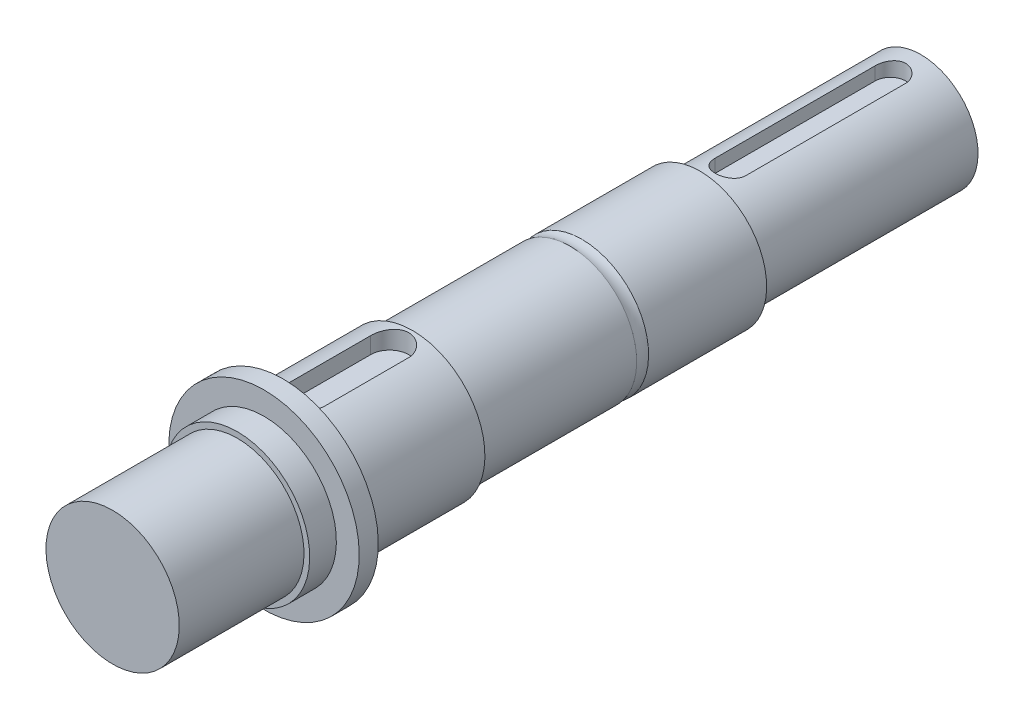
ISO-10303-21;
HEADER;
FILE_DESCRIPTION(('STEP AP214'),'2;1');
FILE_NAME('part.step','',(''),(''),'','','');
FILE_SCHEMA(('AUTOMOTIVE_DESIGN { 1 0 10303 214 1 1 1 1 }'));
ENDSEC;
DATA;
#1=APPLICATION_CONTEXT('core data for automotive mechanical design processes');
#2=APPLICATION_PROTOCOL_DEFINITION('international standard','automotive_design',2000,#1);
#3=PRODUCT_CONTEXT('',#1,'mechanical');
#4=PRODUCT('Part','Part','',(#3));
#5=PRODUCT_RELATED_PRODUCT_CATEGORY('part','',(#4));
#6=PRODUCT_DEFINITION_FORMATION('','',#4);
#7=PRODUCT_DEFINITION_CONTEXT('part definition',#1,'design');
#8=PRODUCT_DEFINITION('design','',#6,#7);
#9=PRODUCT_DEFINITION_SHAPE('','',#8);
#10=(LENGTH_UNIT() NAMED_UNIT(*) SI_UNIT(.MILLI.,.METRE.));
#11=(NAMED_UNIT(*) PLANE_ANGLE_UNIT() SI_UNIT($,.RADIAN.));
#12=(NAMED_UNIT(*) SI_UNIT($,.STERADIAN.) SOLID_ANGLE_UNIT());
#13=UNCERTAINTY_MEASURE_WITH_UNIT(LENGTH_MEASURE(1.E-05),#10,'distance_accuracy_value','');
#14=(GEOMETRIC_REPRESENTATION_CONTEXT(3) GLOBAL_UNCERTAINTY_ASSIGNED_CONTEXT((#13)) GLOBAL_UNIT_ASSIGNED_CONTEXT((#10,
#11,#12)) REPRESENTATION_CONTEXT('',''));
#15=CARTESIAN_POINT('',(0.,0.,0.));
#16=DIRECTION('',(0.,0.,1.));
#17=DIRECTION('',(1.,0.,0.));
#18=AXIS2_PLACEMENT_3D('',#15,#16,#17);
#19=CARTESIAN_POINT('',(0.,0.,0.));
#20=DIRECTION('',(0.,0.,-1.));
#21=DIRECTION('',(0.,1.,0.));
#22=AXIS2_PLACEMENT_3D('',#19,#20,#21);
#23=CYLINDRICAL_SURFACE('',#22,15.);
#24=CARTESIAN_POINT('',(0.,0.,58.));
#25=DIRECTION('',(0.,0.,-1.));
#26=DIRECTION('',(0.,1.,0.));
#27=AXIS2_PLACEMENT_3D('',#24,#25,#26);
#28=CIRCLE('',#27,15.);
#29=CARTESIAN_POINT('',(0.,15.,58.));
#30=VERTEX_POINT('',#29);
#31=EDGE_CURVE('E47',#30,#30,#28,.T.);
#32=ORIENTED_EDGE('',*,*,#31,.T.);
#33=EDGE_LOOP('',(#32));
#34=FACE_BOUND('',#33,.T.);
#35=CARTESIAN_POINT('',(0.,0.,0.));
#36=DIRECTION('',(0.,0.,-1.));
#37=DIRECTION('',(0.,1.,0.));
#38=AXIS2_PLACEMENT_3D('',#35,#36,#37);
#39=CIRCLE('',#38,15.);
#40=CARTESIAN_POINT('',(0.,15.,0.));
#41=VERTEX_POINT('',#40);
#42=EDGE_CURVE('E11',#41,#41,#39,.T.);
#43=ORIENTED_EDGE('',*,*,#42,.F.);
#44=EDGE_LOOP('',(#43));
#45=FACE_BOUND('',#44,.T.);
#46=DIRECTION('',(0.,0.,-1.));
#47=VECTOR('',#46,1.);
#48=CARTESIAN_POINT('',(4.,14.456832294801,0.));
#49=LINE('',#48,#47);
#50=CARTESIAN_POINT('',(4.,14.456832294801,50.));
#51=VERTEX_POINT('',#50);
#52=CARTESIAN_POINT('',(4.,14.456832294801,7.99999999999999));
#53=VERTEX_POINT('',#52);
#54=EDGE_CURVE('E125',#51,#53,#49,.T.);
#55=ORIENTED_EDGE('',*,*,#54,.F.);
#56=CARTESIAN_POINT('',(-4.,14.456832294801,50.));
#57=CARTESIAN_POINT('',(-4.00001309389174,14.4568189842467,50.1103582434041));
#58=CARTESIAN_POINT('',(-3.99543311151603,14.4580956467717,50.2207085219929));
#59=CARTESIAN_POINT('',(-3.97718874589725,14.4631301353516,50.4405786539661));
#60=CARTESIAN_POINT('',(-3.96352604983924,14.4668875005959,50.5500986577597));
#61=CARTESIAN_POINT('',(-3.92725695741263,14.4767740441058,50.767301653514));
#62=CARTESIAN_POINT('',(-3.90466984692446,14.482898107258,50.8749880878483));
#63=CARTESIAN_POINT('',(-3.85076543838184,14.4973231400467,51.0879748603556));
#64=CARTESIAN_POINT('',(-3.81944798699437,14.5056241479174,51.1932751565853));
#65=CARTESIAN_POINT('',(-3.71275643853686,14.5334412456827,51.5044634187753));
#66=CARTESIAN_POINT('',(-3.62460332607936,14.5558829598251,51.7058749335474));
#67=CARTESIAN_POINT('',(-3.4169578047582,14.6060171290377,52.0910207596257));
#68=CARTESIAN_POINT('',(-3.29745504324307,14.6337113178034,52.2747492039724));
#69=CARTESIAN_POINT('',(-3.0273032087801,14.6920016406366,52.6239705769278));
#70=CARTESIAN_POINT('',(-2.87601544465619,14.7226489452442,52.7889618409657));
#71=CARTESIAN_POINT('',(-2.54795832924029,14.7829523618628,53.0915575669616));
#72=CARTESIAN_POINT('',(-2.37118484921249,14.8126083123117,53.2291575828684));
#73=CARTESIAN_POINT('',(-1.99367199592156,14.8681604116921,53.4751721301854));
#74=CARTESIAN_POINT('',(-1.79259414843396,14.8939887414057,53.5830839655783));
#75=CARTESIAN_POINT('',(-1.37435575552791,14.9383834129136,53.7633728889612));
#76=CARTESIAN_POINT('',(-1.15719869214847,14.9569513215518,53.8357576447769));
#77=CARTESIAN_POINT('',(-0.718234307369676,14.9843709217852,53.9413098251693));
#78=CARTESIAN_POINT('',(-0.49664729342811,14.9934353394137,53.9753372128936));
#79=CARTESIAN_POINT('',(-0.0507319917605803,15.0015705103632,54.005914313223));
#80=CARTESIAN_POINT('',(0.173595891963453,15.0006427191926,54.0024694841925));
#81=CARTESIAN_POINT('',(0.61262950264217,14.9890534931376,53.9588043136319));
#82=CARTESIAN_POINT('',(0.827435206418324,14.9786381919443,53.9195138723437));
#83=CARTESIAN_POINT('',(1.24728467665105,14.9495347795912,53.8067748491367));
#84=CARTESIAN_POINT('',(1.45232797980575,14.9308462762363,53.7333246478493));
#85=CARTESIAN_POINT('',(1.84920963545355,14.8869312076945,53.5536400337472));
#86=CARTESIAN_POINT('',(2.04089626466617,14.8616414267933,53.4470866277702));
#87=CARTESIAN_POINT('',(2.40398441957148,14.8072486052897,53.2044572310354));
#88=CARTESIAN_POINT('',(2.57538239000351,14.7781448982353,53.0683760778169));
#89=CARTESIAN_POINT('',(2.8985493503678,14.7182294237973,52.7656720288986));
#90=CARTESIAN_POINT('',(3.04955722400808,14.6873926412643,52.5982419921057));
#91=CARTESIAN_POINT('',(3.32161448391783,14.6282716207252,52.2399571592908));
#92=CARTESIAN_POINT('',(3.4426555807802,14.5999880903709,52.0490959035188));
#93=CARTESIAN_POINT('',(3.59932937334133,14.5618587427771,51.7486467166354));
#94=CARTESIAN_POINT('',(3.64754371945348,14.5498268172621,51.645711084959));
#95=CARTESIAN_POINT('',(3.73509417643326,14.5275984074125,51.4359536787285));
#96=CARTESIAN_POINT('',(3.77443385857863,14.5174011851057,51.3291334875373));
#97=CARTESIAN_POINT('',(3.843867838105,14.4991713081511,51.1124805807798));
#98=CARTESIAN_POINT('',(3.87397173088603,14.4911364080612,51.002651121807));
#99=CARTESIAN_POINT('',(3.92471856960774,14.4774747012191,50.780724778875));
#100=CARTESIAN_POINT('',(3.9453659249532,14.4718467722231,50.66862897718));
#101=CARTESIAN_POINT('',(3.97411378733403,14.4639761334309,50.463748975282));
#102=CARTESIAN_POINT('',(3.98382319960777,14.4613012625133,50.3712035538327));
#103=CARTESIAN_POINT('',(3.99676420153356,14.4577275048596,50.1857746466901));
#104=CARTESIAN_POINT('',(4.00000603663184,14.4568258092259,50.0928919295675));
#105=CARTESIAN_POINT('',(4.,14.456832294801,50.));
#106=B_SPLINE_CURVE_WITH_KNOTS('',3,(#56,#57,#58,#59,#60,#61,#62,#63,#64,#65,#66,#67,#68,#69,
#70,#71,#72,#73,#74,#75,#76,#77,#78,#79,#80,#81,#82,#83,#84,#85,#86,#87,#88,#89,#90,#91,#92,#93,
#94,#95,#96,#97,#98,#99,#100,#101,#102,#103,#104,#105),.UNSPECIFIED.,.F.,.F.,(4,2,2,2,2,2,2,2,2,
2,2,2,2,2,2,2,2,2,2,2,2,2,2,2,4),(0.,0.330958670878051,0.66185588076851,0.992041890688581,
1.32223370010825,1.9819070018718,2.64179842357631,3.3164963753615,3.99130375261118,
4.67691814590523,5.3623844975935,6.03215661862343,6.7018311790669,7.35461236515045,
8.00742449996358,8.66673340793703,9.32615767867957,10.0057598785669,10.6855498604333,
11.0281077435251,11.3705275300852,11.7125903499582,12.0544935096114,12.3335333037377,
12.6121307120356),.UNSPECIFIED.);
#107=CARTESIAN_POINT('',(-4.,14.456832294801,50.));
#108=VERTEX_POINT('',#107);
#109=EDGE_CURVE('E108',#108,#51,#106,.T.);
#110=ORIENTED_EDGE('',*,*,#109,.F.);
#111=DIRECTION('',(0.,0.,-1.));
#112=VECTOR('',#111,1.);
#113=CARTESIAN_POINT('',(-4.,14.456832294801,0.));
#114=LINE('',#113,#112);
#115=CARTESIAN_POINT('',(-4.,14.456832294801,7.99999999999999));
#116=VERTEX_POINT('',#115);
#117=EDGE_CURVE('E119',#116,#108,#114,.F.);
#118=ORIENTED_EDGE('',*,*,#117,.F.);
#119=CARTESIAN_POINT('',(4.,14.456832294801,7.99999999999999));
#120=CARTESIAN_POINT('',(4.00001309389174,14.4568189842467,7.88964175659588));
#121=CARTESIAN_POINT('',(3.99543311151603,14.4580956467717,7.7792914780071));
#122=CARTESIAN_POINT('',(3.97718874589725,14.4631301353517,7.55942134603392));
#123=CARTESIAN_POINT('',(3.96352604983924,14.4668875005959,7.44990134224024));
#124=CARTESIAN_POINT('',(3.92725695741262,14.4767740441058,7.23269834648596));
#125=CARTESIAN_POINT('',(3.90466984692446,14.482898107258,7.12501191215171));
#126=CARTESIAN_POINT('',(3.85076543838184,14.4973231400467,6.91202513964435));
#127=CARTESIAN_POINT('',(3.81944798699437,14.5056241479174,6.80672484341467));
#128=CARTESIAN_POINT('',(3.71275643853686,14.5334412456827,6.49553658122465));
#129=CARTESIAN_POINT('',(3.62460332607936,14.5558829598252,6.29412506645257));
#130=CARTESIAN_POINT('',(3.4169578047582,14.6060171290377,5.90897924037424));
#131=CARTESIAN_POINT('',(3.29745504324306,14.6337113178035,5.72525079602755));
#132=CARTESIAN_POINT('',(3.0273032087801,14.6920016406366,5.37602942307217));
#133=CARTESIAN_POINT('',(2.87601544465619,14.7226489452442,5.21103815903426));
#134=CARTESIAN_POINT('',(2.54795832924029,14.7829523618628,4.90844243303835));
#135=CARTESIAN_POINT('',(2.37118484921249,14.8126083123117,4.77084241713158));
#136=CARTESIAN_POINT('',(1.99367199592156,14.8681604116921,4.52482786981454));
#137=CARTESIAN_POINT('',(1.79259414843396,14.8939887414057,4.41691603442168));
#138=CARTESIAN_POINT('',(1.3743557555279,14.9383834129136,4.23662711103874));
#139=CARTESIAN_POINT('',(1.15719869214847,14.9569513215518,4.16424235522311));
#140=CARTESIAN_POINT('',(0.718234307369673,14.9843709217852,4.05869017483072));
#141=CARTESIAN_POINT('',(0.496647293428108,14.9934353394137,4.02466278710636));
#142=CARTESIAN_POINT('',(0.0507319917605781,15.0015705103632,3.994085686777));
#143=CARTESIAN_POINT('',(-0.173595891963456,15.0006427191926,3.99753051580746));
#144=CARTESIAN_POINT('',(-0.612629502642172,14.9890534931376,4.04119568636814));
#145=CARTESIAN_POINT('',(-0.827435206418326,14.9786381919443,4.0804861276563));
#146=CARTESIAN_POINT('',(-1.24728467665105,14.9495347795912,4.19322515086325));
#147=CARTESIAN_POINT('',(-1.45232797980576,14.9308462762364,4.26667535215072));
#148=CARTESIAN_POINT('',(-1.84920963545355,14.8869312076945,4.44635996625281));
#149=CARTESIAN_POINT('',(-2.04089626466617,14.8616414267933,4.55291337222979));
#150=CARTESIAN_POINT('',(-2.40398441957148,14.8072486052897,4.79554276896464));
#151=CARTESIAN_POINT('',(-2.57538239000351,14.7781448982353,4.93162392218313));
#152=CARTESIAN_POINT('',(-2.8985493503678,14.7182294237973,5.23432797110139));
#153=CARTESIAN_POINT('',(-3.04955722400808,14.6873926412643,5.40175800789429));
#154=CARTESIAN_POINT('',(-3.32161448391783,14.6282716207252,5.76004284070917));
#155=CARTESIAN_POINT('',(-3.4426555807802,14.5999880903709,5.95090409648115));
#156=CARTESIAN_POINT('',(-3.59932937334133,14.5618587427771,6.25135328336461));
#157=CARTESIAN_POINT('',(-3.64754371945348,14.5498268172621,6.35428891504098));
#158=CARTESIAN_POINT('',(-3.73509417643326,14.5275984074125,6.56404632127146));
#159=CARTESIAN_POINT('',(-3.77443385857864,14.5174011851057,6.67086651246274));
#160=CARTESIAN_POINT('',(-3.843867838105,14.4991713081511,6.88751941922018));
#161=CARTESIAN_POINT('',(-3.87397173088604,14.4911364080612,6.99734887819295));
#162=CARTESIAN_POINT('',(-3.92471856960774,14.4774747012191,7.21927522112495));
#163=CARTESIAN_POINT('',(-3.9453659249532,14.4718467722231,7.33137102281998));
#164=CARTESIAN_POINT('',(-3.97411378733403,14.4639761334309,7.53625102471796));
#165=CARTESIAN_POINT('',(-3.98382319960777,14.4613012625133,7.62879644616733));
#166=CARTESIAN_POINT('',(-3.99676420153356,14.4577275048596,7.81422535330987));
#167=CARTESIAN_POINT('',(-4.00000603663184,14.4568258092259,7.90710807043245));
#168=CARTESIAN_POINT('',(-4.,14.456832294801,7.99999999999999));
#169=B_SPLINE_CURVE_WITH_KNOTS('',3,(#119,#120,#121,#122,#123,#124,#125,#126,#127,#128,#129,
#130,#131,#132,#133,#134,#135,#136,#137,#138,#139,#140,#141,#142,#143,#144,#145,#146,#147,#148,
#149,#150,#151,#152,#153,#154,#155,#156,#157,#158,#159,#160,#161,#162,#163,#164,#165,#166,#167,
#168),.UNSPECIFIED.,.F.,.F.,(4,2,2,2,2,2,2,2,2,2,2,2,2,2,2,2,2,2,2,2,2,2,2,2,4),(0.,
0.330958670878053,0.661855880768518,0.992041890688583,1.32223370010825,1.98190700187181,
2.64179842357631,3.3164963753615,3.99130375261119,4.67691814590524,5.36238449759351,
6.03215661862343,6.7018311790669,7.35461236515045,8.00742449996358,8.66673340793703,
9.32615767867957,10.0057598785669,10.6855498604333,11.0281077435251,11.3705275300852,
11.7125903499582,12.0544935096114,12.3335333037377,12.6121307120356),.UNSPECIFIED.);
#170=EDGE_CURVE('E54',#53,#116,#169,.T.);
#171=ORIENTED_EDGE('',*,*,#170,.F.);
#172=EDGE_LOOP('',(#55,#110,#118,#171));
#173=FACE_BOUND('',#172,.T.);
#174=ADVANCED_FACE('F39',(#34,#45,#173),#23,.T.);
#175=CARTESIAN_POINT('',(0.,0.,0.));
#176=DIRECTION('',(0.,0.,-1.));
#177=DIRECTION('',(0.,1.,0.));
#178=AXIS2_PLACEMENT_3D('',#175,#176,#177);
#179=CYLINDRICAL_SURFACE('',#178,19.);
#180=CARTESIAN_POINT('',(0.,0.,167.472498999199));
#181=DIRECTION('',(0.,0.,-1.));
#182=DIRECTION('',(0.,1.,0.));
#183=AXIS2_PLACEMENT_3D('',#180,#181,#182);
#184=CIRCLE('',#183,19.);
#185=CARTESIAN_POINT('',(0.,19.,167.472498999199));
#186=VERTEX_POINT('',#185);
#187=EDGE_CURVE('E303',#186,#186,#184,.T.);
#188=ORIENTED_EDGE('',*,*,#187,.T.);
#189=EDGE_LOOP('',(#188));
#190=FACE_BOUND('',#189,.T.);
#191=CARTESIAN_POINT('',(0.,0.,133.472498999199));
#192=DIRECTION('',(0.,0.,-1.));
#193=DIRECTION('',(0.,1.,0.));
#194=AXIS2_PLACEMENT_3D('',#191,#192,#193);
#195=CIRCLE('',#194,19.);
#196=CARTESIAN_POINT('',(0.,19.,133.472498999199));
#197=VERTEX_POINT('',#196);
#198=EDGE_CURVE('E306',#197,#197,#195,.T.);
#199=ORIENTED_EDGE('',*,*,#198,.F.);
#200=EDGE_LOOP('',(#199));
#201=FACE_BOUND('',#200,.T.);
#202=DIRECTION('',(0.,0.,-1.));
#203=VECTOR('',#202,1.);
#204=CARTESIAN_POINT('',(-5.,18.3303027798234,0.));
#205=LINE('',#204,#203);
#206=CARTESIAN_POINT('',(-5.,18.3303027798233,139.472498999199));
#207=VERTEX_POINT('',#206);
#208=CARTESIAN_POINT('',(-5.,18.3303027798233,161.472498999199));
#209=VERTEX_POINT('',#208);
#210=EDGE_CURVE('E238',#207,#209,#205,.F.);
#211=ORIENTED_EDGE('',*,*,#210,.F.);
#212=CARTESIAN_POINT('',(5.,18.3303027798233,139.472498999199));
#213=CARTESIAN_POINT('',(5.00001766668261,18.3302859082857,139.334482801999));
#214=CARTESIAN_POINT('',(4.9942862066955,18.3318609913296,139.196472803115));
#215=CARTESIAN_POINT('',(4.97145574831055,18.3380720236008,138.921489945628));
#216=CARTESIAN_POINT('',(4.95435881807959,18.3427074159445,138.784516902917));
#217=CARTESIAN_POINT('',(4.90897601752027,18.3549032155987,138.512868898157));
#218=CARTESIAN_POINT('',(4.88071385252822,18.3624574251155,138.378189693837));
#219=CARTESIAN_POINT('',(4.81324620313061,18.3802580223182,138.111785200938));
#220=CARTESIAN_POINT('',(4.77404053558504,18.3905044550585,137.980059961833));
#221=CARTESIAN_POINT('',(4.68501289335865,18.4133853968542,137.720510777924));
#222=CARTESIAN_POINT('',(4.63519496528776,18.4260189954416,137.592685367238));
#223=CARTESIAN_POINT('',(4.5253255354239,18.4533094170246,137.341718638068));
#224=CARTESIAN_POINT('',(4.46527023534238,18.4679669905744,137.218579078956));
#225=CARTESIAN_POINT('',(4.27037749337003,18.5143659713688,136.857434570856));
#226=CARTESIAN_POINT('',(4.12074697519632,18.5485515146361,136.627511658339));
#227=CARTESIAN_POINT('',(3.78266195018417,18.6204696894086,136.190809626234));
#228=CARTESIAN_POINT('',(3.59343075278063,18.658263492612,135.984645787337));
#229=CARTESIAN_POINT('',(3.18310193538119,18.732625835079,135.606536554185));
#230=CARTESIAN_POINT('',(2.9619991701209,18.76919417533,135.434596695653));
#231=CARTESIAN_POINT('',(2.48996924780925,18.8376675811324,135.127319584838));
#232=CARTESIAN_POINT('',(2.23863143936238,18.8694912031433,134.992593709929));
#233=CARTESIAN_POINT('',(1.71590637997249,18.9241806310349,134.76754551691));
#234=CARTESIAN_POINT('',(1.4445233870098,18.9470483328572,134.677213799657));
#235=CARTESIAN_POINT('',(0.895832897884257,18.9808144065777,134.54550190704));
#236=CARTESIAN_POINT('',(0.618792947064009,18.9919686097243,134.503073855571));
#237=CARTESIAN_POINT('',(0.0613112052362503,19.0019448285789,134.465078030452));
#238=CARTESIAN_POINT('',(-0.219130099359582,19.0007685873121,134.469503633593));
#239=CARTESIAN_POINT('',(-0.768151117298726,18.9864044979906,134.524347631687));
#240=CARTESIAN_POINT('',(-1.03685296683871,18.9735125161181,134.573633193676));
#241=CARTESIAN_POINT('',(-1.562032997849,18.9375121568335,134.714978744578));
#242=CARTESIAN_POINT('',(-1.81851060691425,18.9144033015318,134.80704073435));
#243=CARTESIAN_POINT('',(-2.3148475496931,18.8601298911963,135.032170177108));
#244=CARTESIAN_POINT('',(-2.55452016615558,18.8288888816724,135.165629239597));
#245=CARTESIAN_POINT('',(-3.00854301144997,18.7616994100197,135.469595713942));
#246=CARTESIAN_POINT('',(-3.22288893283456,18.7257501493189,135.64010941392));
#247=CARTESIAN_POINT('',(-3.52419659305494,18.6705907034911,135.922871667875));
#248=CARTESIAN_POINT('',(-3.62255621938199,18.6517101060183,136.023317751646));
#249=CARTESIAN_POINT('',(-3.81048914275926,18.6142238908637,136.232148374883));
#250=CARTESIAN_POINT('',(-3.90006550620352,18.595618179155,136.340530120618));
#251=CARTESIAN_POINT('',(-4.06988196131281,18.5591922415691,136.564605512996));
#252=CARTESIAN_POINT('',(-4.15011584380694,18.5413725429207,136.680303944508));
#253=CARTESIAN_POINT('',(-4.3005928981472,18.5070487697456,136.918151080689));
#254=CARTESIAN_POINT('',(-4.3708399379606,18.4905441869608,137.040297262831));
#255=CARTESIAN_POINT('',(-4.50130100976656,18.4592205654969,137.291121221319));
#256=CARTESIAN_POINT('',(-4.56144316630362,18.4444138217068,137.419837942786));
#257=CARTESIAN_POINT('',(-4.67060599397032,18.4170737812662,137.682079480529));
#258=CARTESIAN_POINT('',(-4.71963113120057,18.4045395720651,137.81560234094));
#259=CARTESIAN_POINT('',(-4.80613348025077,18.3821401987773,138.086402297545));
#260=CARTESIAN_POINT('',(-4.84362266837274,18.3722722679413,138.223675338051));
#261=CARTESIAN_POINT('',(-4.90677851660471,18.3555057309761,138.501035125225));
#262=CARTESIAN_POINT('',(-4.93245069281332,18.3486057395322,138.641120527167));
#263=CARTESIAN_POINT('',(-4.96805016310397,18.3389956133326,138.896467006652));
#264=CARTESIAN_POINT('',(-4.98003415018343,18.3357406080542,139.011425424659));
#265=CARTESIAN_POINT('',(-4.99600639007608,18.3313920220703,139.241752428472));
#266=CARTESIAN_POINT('',(-5.00000735763538,18.3302950043258,139.357120068382));
#267=CARTESIAN_POINT('',(-5.,18.3303027798233,139.472498999199));
#268=B_SPLINE_CURVE_WITH_KNOTS('',3,(#212,#213,#214,#215,#216,#217,#218,#219,#220,#221,#222,
#223,#224,#225,#226,#227,#228,#229,#230,#231,#232,#233,#234,#235,#236,#237,#238,#239,#240,#241,
#242,#243,#244,#245,#246,#247,#248,#249,#250,#251,#252,#253,#254,#255,#256,#257,#258,#259,#260,
#261,#262,#263,#264,#265,#266,#267),.UNSPECIFIED.,.F.,.F.,(4,2,2,2,2,2,2,2,2,2,2,2,2,2,2,2,2,2,
2,2,2,2,2,2,2,2,2,4),(0.,0.413911055875678,0.827746813248318,1.24070862177833,1.65367734165684,
2.06648887151102,2.47945389814996,3.30477934860257,4.14813364543845,4.99162424403128,
5.84824381544334,6.70468194490245,7.54199904887895,8.3791977917408,9.19582441640863,
10.0124892424595,10.8371281703848,11.6619071478274,12.0870382665453,12.5120204319564,
12.9372834547274,13.3623813190941,13.7903854272744,14.2182172852097,14.6456034696819,
15.0727899504498,15.4193832237595,15.7654240276075),.UNSPECIFIED.);
#269=CARTESIAN_POINT('',(5.,18.3303027798233,139.472498999199));
#270=VERTEX_POINT('',#269);
#271=EDGE_CURVE('E229',#270,#207,#268,.T.);
#272=ORIENTED_EDGE('',*,*,#271,.F.);
#273=DIRECTION('',(0.,0.,-1.));
#274=VECTOR('',#273,1.);
#275=CARTESIAN_POINT('',(5.,18.3303027798234,0.));
#276=LINE('',#275,#274);
#277=CARTESIAN_POINT('',(5.,18.3303027798233,161.472498999199));
#278=VERTEX_POINT('',#277);
#279=EDGE_CURVE('E261',#278,#270,#276,.T.);
#280=ORIENTED_EDGE('',*,*,#279,.F.);
#281=CARTESIAN_POINT('',(-5.,18.3303027798233,161.472498999199));
#282=CARTESIAN_POINT('',(-5.00001766668261,18.3302859082857,161.6105151964));
#283=CARTESIAN_POINT('',(-4.9942862066955,18.3318609913296,161.748525195284));
#284=CARTESIAN_POINT('',(-4.97145574831054,18.3380720236008,162.02350805277));
#285=CARTESIAN_POINT('',(-4.95435881807958,18.3427074159445,162.160481095481));
#286=CARTESIAN_POINT('',(-4.90897601752026,18.3549032155987,162.432129100241));
#287=CARTESIAN_POINT('',(-4.88071385252822,18.3624574251155,162.566808304561));
#288=CARTESIAN_POINT('',(-4.81324620313061,18.3802580223182,162.83321279746));
#289=CARTESIAN_POINT('',(-4.77404053558504,18.3905044550585,162.964938036565));
#290=CARTESIAN_POINT('',(-4.68501289335865,18.4133853968542,163.224487220475));
#291=CARTESIAN_POINT('',(-4.63519496528777,18.4260189954416,163.352312631161));
#292=CARTESIAN_POINT('',(-4.52532553542391,18.4533094170246,163.60327936033));
#293=CARTESIAN_POINT('',(-4.4652702353424,18.4679669905744,163.726418919442));
#294=CARTESIAN_POINT('',(-4.27037749337005,18.5143659713688,164.087563427543));
#295=CARTESIAN_POINT('',(-4.12074697519633,18.5485515146361,164.31748634006));
#296=CARTESIAN_POINT('',(-3.78266195018417,18.6204696894086,164.754188372164));
#297=CARTESIAN_POINT('',(-3.59343075278062,18.658263492612,164.960352211062));
#298=CARTESIAN_POINT('',(-3.18310193538118,18.732625835079,165.338461444214));
#299=CARTESIAN_POINT('',(-2.9619991701209,18.76919417533,165.510401302745));
#300=CARTESIAN_POINT('',(-2.48996924780925,18.8376675811324,165.81767841356));
#301=CARTESIAN_POINT('',(-2.23863143936237,18.8694912031433,165.952404288469));
#302=CARTESIAN_POINT('',(-1.71590637997248,18.9241806310349,166.177452481488));
#303=CARTESIAN_POINT('',(-1.4445233870098,18.9470483328572,166.267784198742));
#304=CARTESIAN_POINT('',(-0.895832897884251,18.9808144065777,166.399496091359));
#305=CARTESIAN_POINT('',(-0.618792947064003,18.9919686097243,166.441924142827));
#306=CARTESIAN_POINT('',(-0.0613112052362446,19.0019448285789,166.479919967947));
#307=CARTESIAN_POINT('',(0.219130099359587,19.0007685873121,166.475494364806));
#308=CARTESIAN_POINT('',(0.768151117298731,18.9864044979906,166.420650366711));
#309=CARTESIAN_POINT('',(1.03685296683871,18.9735125161181,166.371364804722));
#310=CARTESIAN_POINT('',(1.562032997849,18.9375121568335,166.23001925382));
#311=CARTESIAN_POINT('',(1.81851060691425,18.9144033015318,166.137957264048));
#312=CARTESIAN_POINT('',(2.31484754969311,18.8601298911963,165.912827821291));
#313=CARTESIAN_POINT('',(2.55452016615559,18.8288888816724,165.779368758802));
#314=CARTESIAN_POINT('',(3.00854301144998,18.7616994100196,165.475402284456));
#315=CARTESIAN_POINT('',(3.22288893283457,18.7257501493189,165.304888584478));
#316=CARTESIAN_POINT('',(3.52419659305494,18.6705907034911,165.022126330524));
#317=CARTESIAN_POINT('',(3.622556219382,18.6517101060183,164.921680246753));
#318=CARTESIAN_POINT('',(3.81048914275927,18.6142238908637,164.712849623516));
#319=CARTESIAN_POINT('',(3.90006550620352,18.595618179155,164.60446787778));
#320=CARTESIAN_POINT('',(4.06988196131281,18.5591922415691,164.380392485402));
#321=CARTESIAN_POINT('',(4.15011584380695,18.5413725429207,164.264694053891));
#322=CARTESIAN_POINT('',(4.30059289814721,18.5070487697456,164.026846917709));
#323=CARTESIAN_POINT('',(4.3708399379606,18.4905441869608,163.904700735567));
#324=CARTESIAN_POINT('',(4.50130100976657,18.4592205654969,163.653876777079));
#325=CARTESIAN_POINT('',(4.56144316630362,18.4444138217068,163.525160055612));
#326=CARTESIAN_POINT('',(4.67060599397033,18.4170737812662,163.262918517869));
#327=CARTESIAN_POINT('',(4.71963113120058,18.4045395720651,163.129395657459));
#328=CARTESIAN_POINT('',(4.80613348025078,18.3821401987773,162.858595700854));
#329=CARTESIAN_POINT('',(4.84362266837274,18.3722722679413,162.721322660347));
#330=CARTESIAN_POINT('',(4.90677851660472,18.3555057309761,162.443962873173));
#331=CARTESIAN_POINT('',(4.93245069281332,18.3486057395322,162.303877471232));
#332=CARTESIAN_POINT('',(4.96805016310397,18.3389956133326,162.048530991746));
#333=CARTESIAN_POINT('',(4.98003415018344,18.3357406080542,161.93357257374));
#334=CARTESIAN_POINT('',(4.99600639007608,18.3313920220703,161.703245569926));
#335=CARTESIAN_POINT('',(5.00000735763538,18.3302950043258,161.587877930016));
#336=CARTESIAN_POINT('',(5.,18.3303027798233,161.472498999199));
#337=B_SPLINE_CURVE_WITH_KNOTS('',3,(#281,#282,#283,#284,#285,#286,#287,#288,#289,#290,#291,
#292,#293,#294,#295,#296,#297,#298,#299,#300,#301,#302,#303,#304,#305,#306,#307,#308,#309,#310,
#311,#312,#313,#314,#315,#316,#317,#318,#319,#320,#321,#322,#323,#324,#325,#326,#327,#328,#329,
#330,#331,#332,#333,#334,#335,#336),.UNSPECIFIED.,.F.,.F.,(4,2,2,2,2,2,2,2,2,2,2,2,2,2,2,2,2,2,
2,2,2,2,2,2,2,2,2,4),(0.,0.413911055875678,0.827746813248318,1.24070862177833,1.65367734165684,
2.06648887151099,2.47945389814989,3.30477934860257,4.14813364543845,4.99162424403128,
5.84824381544334,6.70468194490245,7.54199904887895,8.3791977917408,9.19582441640862,
10.0124892424595,10.8371281703848,11.6619071478274,12.0870382665453,12.5120204319564,
12.9372834547274,13.3623813190941,13.7903854272744,14.2182172852097,14.6456034696819,
15.0727899504498,15.4193832237595,15.7654240276075),.UNSPECIFIED.);
#338=EDGE_CURVE('E62',#209,#278,#337,.T.);
#339=ORIENTED_EDGE('',*,*,#338,.F.);
#340=EDGE_LOOP('',(#211,#272,#280,#339));
#341=FACE_BOUND('',#340,.T.);
#342=ADVANCED_FACE('F162',(#190,#201,#341),#179,.T.);
#343=CARTESIAN_POINT('',(0.,0.,0.));
#344=DIRECTION('',(0.,0.,-1.));
#345=DIRECTION('',(0.,1.,0.));
#346=AXIS2_PLACEMENT_3D('',#343,#344,#345);
#347=PLANE('',#346);
#348=ORIENTED_EDGE('',*,*,#42,.T.);
#349=EDGE_LOOP('',(#348));
#350=FACE_BOUND('',#349,.T.);
#351=ADVANCED_FACE('F41',(#350),#347,.T.);
#352=CARTESIAN_POINT('',(0.,15.,58.));
#353=DIRECTION('',(0.,0.,-1.));
#354=DIRECTION('',(0.,1.,0.));
#355=AXIS2_PLACEMENT_3D('',#352,#353,#354);
#356=PLANE('',#355);
#357=CARTESIAN_POINT('',(0.,0.,58.));
#358=DIRECTION('',(0.,0.,-1.));
#359=DIRECTION('',(0.,1.,0.));
#360=AXIS2_PLACEMENT_3D('',#357,#358,#359);
#361=CIRCLE('',#360,17.5);
#362=CARTESIAN_POINT('',(0.,17.5,58.));
#363=VERTEX_POINT('',#362);
#364=EDGE_CURVE('E318',#363,#363,#361,.T.);
#365=ORIENTED_EDGE('',*,*,#364,.T.);
#366=EDGE_LOOP('',(#365));
#367=FACE_BOUND('',#366,.T.);
#368=ORIENTED_EDGE('',*,*,#31,.F.);
#369=EDGE_LOOP('',(#368));
#370=FACE_BOUND('',#369,.T.);
#371=ADVANCED_FACE('F173',(#367,#370),#356,.T.);
#372=CARTESIAN_POINT('',(0.,0.,0.));
#373=DIRECTION('',(0.,0.,-1.));
#374=DIRECTION('',(0.,1.,0.));
#375=AXIS2_PLACEMENT_3D('',#372,#373,#374);
#376=CYLINDRICAL_SURFACE('',#375,17.5);
#377=CARTESIAN_POINT('',(0.,0.,89.));
#378=DIRECTION('',(0.,0.,-1.));
#379=DIRECTION('',(0.,1.,0.));
#380=AXIS2_PLACEMENT_3D('',#377,#378,#379);
#381=CIRCLE('',#380,17.5);
#382=CARTESIAN_POINT('',(0.,17.5,89.));
#383=VERTEX_POINT('',#382);
#384=EDGE_CURVE('E315',#383,#383,#381,.T.);
#385=ORIENTED_EDGE('',*,*,#384,.T.);
#386=EDGE_LOOP('',(#385));
#387=FACE_BOUND('',#386,.T.);
#388=ORIENTED_EDGE('',*,*,#364,.F.);
#389=EDGE_LOOP('',(#388));
#390=FACE_BOUND('',#389,.T.);
#391=ADVANCED_FACE('F176',(#387,#390),#376,.T.);
#392=CARTESIAN_POINT('',(0.,0.,90.5612494995996));
#393=DIRECTION('',(0.,0.,-1.));
#394=DIRECTION('',(0.,1.,0.));
#395=AXIS2_PLACEMENT_3D('',#392,#393,#394);
#396=TOROIDAL_SURFACE('',#395,22.25,4.99999999999999);
#397=CARTESIAN_POINT('',(0.,0.,92.1224989991992));
#398=DIRECTION('',(0.,0.,-1.));
#399=DIRECTION('',(0.,1.,0.));
#400=AXIS2_PLACEMENT_3D('',#397,#398,#399);
#401=CIRCLE('',#400,17.5);
#402=CARTESIAN_POINT('',(0.,17.5,92.1224989991992));
#403=VERTEX_POINT('',#402);
#404=EDGE_CURVE('E312',#403,#403,#401,.T.);
#405=ORIENTED_EDGE('',*,*,#404,.T.);
#406=EDGE_LOOP('',(#405));
#407=FACE_BOUND('',#406,.T.);
#408=ORIENTED_EDGE('',*,*,#384,.F.);
#409=EDGE_LOOP('',(#408));
#410=FACE_BOUND('',#409,.T.);
#411=ADVANCED_FACE('F180',(#407,#410),#396,.F.);
#412=CARTESIAN_POINT('',(0.,0.,0.));
#413=DIRECTION('',(0.,0.,-1.));
#414=DIRECTION('',(0.,1.,0.));
#415=AXIS2_PLACEMENT_3D('',#412,#413,#414);
#416=CYLINDRICAL_SURFACE('',#415,17.5);
#417=CARTESIAN_POINT('',(0.,0.,133.472498999199));
#418=DIRECTION('',(0.,0.,-1.));
#419=DIRECTION('',(0.,1.,0.));
#420=AXIS2_PLACEMENT_3D('',#417,#418,#419);
#421=CIRCLE('',#420,17.5);
#422=CARTESIAN_POINT('',(0.,17.5,133.472498999199));
#423=VERTEX_POINT('',#422);
#424=EDGE_CURVE('E309',#423,#423,#421,.T.);
#425=ORIENTED_EDGE('',*,*,#424,.T.);
#426=EDGE_LOOP('',(#425));
#427=FACE_BOUND('',#426,.T.);
#428=ORIENTED_EDGE('',*,*,#404,.F.);
#429=EDGE_LOOP('',(#428));
#430=FACE_BOUND('',#429,.T.);
#431=ADVANCED_FACE('F184',(#427,#430),#416,.T.);
#432=CARTESIAN_POINT('',(0.,17.5,133.472498999199));
#433=DIRECTION('',(0.,0.,-1.));
#434=DIRECTION('',(0.,1.,0.));
#435=AXIS2_PLACEMENT_3D('',#432,#433,#434);
#436=PLANE('',#435);
#437=ORIENTED_EDGE('',*,*,#198,.T.);
#438=EDGE_LOOP('',(#437));
#439=FACE_BOUND('',#438,.T.);
#440=ORIENTED_EDGE('',*,*,#424,.F.);
#441=EDGE_LOOP('',(#440));
#442=FACE_BOUND('',#441,.T.);
#443=ADVANCED_FACE('F188',(#439,#442),#436,.T.);
#444=CARTESIAN_POINT('',(0.,19.,167.472498999199));
#445=DIRECTION('',(0.,0.,-1.));
#446=DIRECTION('',(0.,1.,0.));
#447=AXIS2_PLACEMENT_3D('',#444,#445,#446);
#448=PLANE('',#447);
#449=CARTESIAN_POINT('',(0.,0.,167.472498999199));
#450=DIRECTION('',(0.,0.,-1.));
#451=DIRECTION('',(0.,1.,0.));
#452=AXIS2_PLACEMENT_3D('',#449,#450,#451);
#453=CIRCLE('',#452,25.);
#454=CARTESIAN_POINT('',(0.,25.,167.472498999199));
#455=VERTEX_POINT('',#454);
#456=EDGE_CURVE('E300',#455,#455,#453,.T.);
#457=ORIENTED_EDGE('',*,*,#456,.T.);
#458=EDGE_LOOP('',(#457));
#459=FACE_BOUND('',#458,.T.);
#460=ORIENTED_EDGE('',*,*,#187,.F.);
#461=EDGE_LOOP('',(#460));
#462=FACE_BOUND('',#461,.T.);
#463=ADVANCED_FACE('F191',(#459,#462),#448,.T.);
#464=CARTESIAN_POINT('',(0.,0.,0.));
#465=DIRECTION('',(0.,0.,-1.));
#466=DIRECTION('',(0.,1.,0.));
#467=AXIS2_PLACEMENT_3D('',#464,#465,#466);
#468=CYLINDRICAL_SURFACE('',#467,25.);
#469=CARTESIAN_POINT('',(0.,0.,172.472498999199));
#470=DIRECTION('',(0.,0.,-1.));
#471=DIRECTION('',(0.,1.,0.));
#472=AXIS2_PLACEMENT_3D('',#469,#470,#471);
#473=CIRCLE('',#472,25.);
#474=CARTESIAN_POINT('',(0.,25.,172.472498999199));
#475=VERTEX_POINT('',#474);
#476=EDGE_CURVE('E297',#475,#475,#473,.T.);
#477=ORIENTED_EDGE('',*,*,#476,.T.);
#478=EDGE_LOOP('',(#477));
#479=FACE_BOUND('',#478,.T.);
#480=ORIENTED_EDGE('',*,*,#456,.F.);
#481=EDGE_LOOP('',(#480));
#482=FACE_BOUND('',#481,.T.);
#483=ADVANCED_FACE('F196',(#479,#482),#468,.T.);
#484=CARTESIAN_POINT('',(0.,25.,172.472498999199));
#485=DIRECTION('',(0.,0.,1.));
#486=DIRECTION('',(0.,-1.,0.));
#487=AXIS2_PLACEMENT_3D('',#484,#485,#486);
#488=PLANE('',#487);
#489=CARTESIAN_POINT('',(0.,0.,172.472498999199));
#490=DIRECTION('',(0.,0.,-1.));
#491=DIRECTION('',(0.,1.,0.));
#492=AXIS2_PLACEMENT_3D('',#489,#490,#491);
#493=CIRCLE('',#492,19.);
#494=CARTESIAN_POINT('',(0.,19.,172.472498999199));
#495=VERTEX_POINT('',#494);
#496=EDGE_CURVE('E294',#495,#495,#493,.T.);
#497=ORIENTED_EDGE('',*,*,#496,.T.);
#498=EDGE_LOOP('',(#497));
#499=FACE_BOUND('',#498,.T.);
#500=ORIENTED_EDGE('',*,*,#476,.F.);
#501=EDGE_LOOP('',(#500));
#502=FACE_BOUND('',#501,.T.);
#503=ADVANCED_FACE('F200',(#499,#502),#488,.T.);
#504=CARTESIAN_POINT('',(0.,0.,0.));
#505=DIRECTION('',(0.,0.,-1.));
#506=DIRECTION('',(0.,1.,0.));
#507=AXIS2_PLACEMENT_3D('',#504,#505,#506);
#508=CYLINDRICAL_SURFACE('',#507,19.);
#509=CARTESIAN_POINT('',(0.,0.,179.472498999199));
#510=DIRECTION('',(0.,0.,-1.));
#511=DIRECTION('',(0.,1.,0.));
#512=AXIS2_PLACEMENT_3D('',#509,#510,#511);
#513=CIRCLE('',#512,19.);
#514=CARTESIAN_POINT('',(0.,19.,179.472498999199));
#515=VERTEX_POINT('',#514);
#516=EDGE_CURVE('E291',#515,#515,#513,.T.);
#517=ORIENTED_EDGE('',*,*,#516,.T.);
#518=EDGE_LOOP('',(#517));
#519=FACE_BOUND('',#518,.T.);
#520=ORIENTED_EDGE('',*,*,#496,.F.);
#521=EDGE_LOOP('',(#520));
#522=FACE_BOUND('',#521,.T.);
#523=ADVANCED_FACE('F204',(#519,#522),#508,.T.);
#524=CARTESIAN_POINT('',(0.,19.,179.472498999199));
#525=DIRECTION('',(0.,0.,1.));
#526=DIRECTION('',(0.,-1.,0.));
#527=AXIS2_PLACEMENT_3D('',#524,#525,#526);
#528=PLANE('',#527);
#529=CARTESIAN_POINT('',(0.,0.,179.472498999199));
#530=DIRECTION('',(0.,0.,-1.));
#531=DIRECTION('',(0.,1.,0.));
#532=AXIS2_PLACEMENT_3D('',#529,#530,#531);
#533=CIRCLE('',#532,17.5);
#534=CARTESIAN_POINT('',(0.,17.5,179.472498999199));
#535=VERTEX_POINT('',#534);
#536=EDGE_CURVE('E288',#535,#535,#533,.T.);
#537=ORIENTED_EDGE('',*,*,#536,.T.);
#538=EDGE_LOOP('',(#537));
#539=FACE_BOUND('',#538,.T.);
#540=ORIENTED_EDGE('',*,*,#516,.F.);
#541=EDGE_LOOP('',(#540));
#542=FACE_BOUND('',#541,.T.);
#543=ADVANCED_FACE('F208',(#539,#542),#528,.T.);
#544=CARTESIAN_POINT('',(0.,0.,0.));
#545=DIRECTION('',(0.,0.,-1.));
#546=DIRECTION('',(0.,1.,0.));
#547=AXIS2_PLACEMENT_3D('',#544,#545,#546);
#548=CYLINDRICAL_SURFACE('',#547,17.5);
#549=CARTESIAN_POINT('',(0.,0.,212.222498999199));
#550=DIRECTION('',(0.,0.,-1.));
#551=DIRECTION('',(0.,1.,0.));
#552=AXIS2_PLACEMENT_3D('',#549,#550,#551);
#553=CIRCLE('',#552,17.5);
#554=CARTESIAN_POINT('',(0.,17.5,212.222498999199));
#555=VERTEX_POINT('',#554);
#556=EDGE_CURVE('E268',#555,#555,#553,.T.);
#557=ORIENTED_EDGE('',*,*,#556,.T.);
#558=EDGE_LOOP('',(#557));
#559=FACE_BOUND('',#558,.T.);
#560=ORIENTED_EDGE('',*,*,#536,.F.);
#561=EDGE_LOOP('',(#560));
#562=FACE_BOUND('',#561,.T.);
#563=ADVANCED_FACE('F212',(#559,#562),#548,.T.);
#564=CARTESIAN_POINT('',(0.,17.5,212.222498999199));
#565=DIRECTION('',(0.,0.,1.));
#566=DIRECTION('',(0.,-1.,0.));
#567=AXIS2_PLACEMENT_3D('',#564,#565,#566);
#568=PLANE('',#567);
#569=ORIENTED_EDGE('',*,*,#556,.F.);
#570=EDGE_LOOP('',(#569));
#571=FACE_BOUND('',#570,.T.);
#572=ADVANCED_FACE('F216',(#571),#568,.T.);
#573=CARTESIAN_POINT('',(0.,25.001,139.472498999199));
#574=DIRECTION('',(0.,-1.,0.));
#575=DIRECTION('',(0.,0.,-1.));
#576=AXIS2_PLACEMENT_3D('',#573,#574,#575);
#577=CYLINDRICAL_SURFACE('',#576,5.);
#578=ORIENTED_EDGE('',*,*,#271,.T.);
#579=DIRECTION('',(0.,-1.,0.));
#580=VECTOR('',#579,1.);
#581=CARTESIAN_POINT('',(-5.,25.001,139.472498999199));
#582=LINE('',#581,#580);
#583=CARTESIAN_POINT('',(-5.,14.,139.472498999199));
#584=VERTEX_POINT('',#583);
#585=EDGE_CURVE('E269',#207,#584,#582,.T.);
#586=ORIENTED_EDGE('',*,*,#585,.T.);
#587=CARTESIAN_POINT('',(0.,14.,139.472498999199));
#588=DIRECTION('',(0.,1.,0.));
#589=DIRECTION('',(0.,0.,1.));
#590=AXIS2_PLACEMENT_3D('',#587,#588,#589);
#591=CIRCLE('',#590,5.);
#592=CARTESIAN_POINT('',(5.,14.,139.472498999199));
#593=VERTEX_POINT('',#592);
#594=EDGE_CURVE('E237',#593,#584,#591,.T.);
#595=ORIENTED_EDGE('',*,*,#594,.F.);
#596=DIRECTION('',(0.,-1.,0.));
#597=VECTOR('',#596,1.);
#598=CARTESIAN_POINT('',(5.,25.001,139.472498999199));
#599=LINE('',#598,#597);
#600=EDGE_CURVE('E264',#270,#593,#599,.T.);
#601=ORIENTED_EDGE('',*,*,#600,.F.);
#602=EDGE_LOOP('',(#578,#586,#595,#601));
#603=FACE_BOUND('',#602,.T.);
#604=ADVANCED_FACE('F220',(#603),#577,.F.);
#605=CARTESIAN_POINT('',(-5.,25.001,139.472498999199));
#606=DIRECTION('',(1.,0.,0.));
#607=DIRECTION('',(0.,0.,-1.));
#608=AXIS2_PLACEMENT_3D('',#605,#606,#607);
#609=PLANE('',#608);
#610=ORIENTED_EDGE('',*,*,#210,.T.);
#611=DIRECTION('',(0.,-1.,0.));
#612=VECTOR('',#611,1.);
#613=CARTESIAN_POINT('',(-5.,25.001,161.472498999199));
#614=LINE('',#613,#612);
#615=CARTESIAN_POINT('',(-5.,14.,161.472498999199));
#616=VERTEX_POINT('',#615);
#617=EDGE_CURVE('E278',#209,#616,#614,.T.);
#618=ORIENTED_EDGE('',*,*,#617,.T.);
#619=DIRECTION('',(0.,0.,1.));
#620=VECTOR('',#619,1.);
#621=CARTESIAN_POINT('',(-5.,14.,139.472498999199));
#622=LINE('',#621,#620);
#623=EDGE_CURVE('E347',#584,#616,#622,.T.);
#624=ORIENTED_EDGE('',*,*,#623,.F.);
#625=ORIENTED_EDGE('',*,*,#585,.F.);
#626=EDGE_LOOP('',(#610,#618,#624,#625));
#627=FACE_BOUND('',#626,.T.);
#628=ADVANCED_FACE('F225',(#627),#609,.T.);
#629=CARTESIAN_POINT('',(0.,25.001,161.472498999199));
#630=DIRECTION('',(0.,-1.,0.));
#631=DIRECTION('',(0.,0.,-1.));
#632=AXIS2_PLACEMENT_3D('',#629,#630,#631);
#633=CYLINDRICAL_SURFACE('',#632,5.);
#634=ORIENTED_EDGE('',*,*,#338,.T.);
#635=DIRECTION('',(0.,-1.,0.));
#636=VECTOR('',#635,1.);
#637=CARTESIAN_POINT('',(5.,25.001,161.472498999199));
#638=LINE('',#637,#636);
#639=CARTESIAN_POINT('',(5.,14.,161.472498999199));
#640=VERTEX_POINT('',#639);
#641=EDGE_CURVE('E266',#278,#640,#638,.T.);
#642=ORIENTED_EDGE('',*,*,#641,.T.);
#643=CARTESIAN_POINT('',(0.,14.,161.472498999199));
#644=DIRECTION('',(0.,1.,0.));
#645=DIRECTION('',(0.,0.,1.));
#646=AXIS2_PLACEMENT_3D('',#643,#644,#645);
#647=CIRCLE('',#646,5.);
#648=EDGE_CURVE('E280',#616,#640,#647,.T.);
#649=ORIENTED_EDGE('',*,*,#648,.F.);
#650=ORIENTED_EDGE('',*,*,#617,.F.);
#651=EDGE_LOOP('',(#634,#642,#649,#650));
#652=FACE_BOUND('',#651,.T.);
#653=ADVANCED_FACE('F250',(#652),#633,.F.);
#654=CARTESIAN_POINT('',(5.,25.001,139.472498999199));
#655=DIRECTION('',(-1.,0.,0.));
#656=DIRECTION('',(0.,0.,1.));
#657=AXIS2_PLACEMENT_3D('',#654,#655,#656);
#658=PLANE('',#657);
#659=ORIENTED_EDGE('',*,*,#279,.T.);
#660=ORIENTED_EDGE('',*,*,#600,.T.);
#661=DIRECTION('',(0.,0.,-1.));
#662=VECTOR('',#661,1.);
#663=CARTESIAN_POINT('',(5.,14.,139.472498999199));
#664=LINE('',#663,#662);
#665=EDGE_CURVE('E276',#640,#593,#664,.T.);
#666=ORIENTED_EDGE('',*,*,#665,.F.);
#667=ORIENTED_EDGE('',*,*,#641,.F.);
#668=EDGE_LOOP('',(#659,#660,#666,#667));
#669=FACE_BOUND('',#668,.T.);
#670=ADVANCED_FACE('F253',(#669),#658,.T.);
#671=CARTESIAN_POINT('',(0.,14.,139.472498999199));
#672=DIRECTION('',(0.,1.,0.));
#673=DIRECTION('',(0.,0.,1.));
#674=AXIS2_PLACEMENT_3D('',#671,#672,#673);
#675=PLANE('',#674);
#676=ORIENTED_EDGE('',*,*,#594,.T.);
#677=ORIENTED_EDGE('',*,*,#623,.T.);
#678=ORIENTED_EDGE('',*,*,#648,.T.);
#679=ORIENTED_EDGE('',*,*,#665,.T.);
#680=EDGE_LOOP('',(#676,#677,#678,#679));
#681=FACE_BOUND('',#680,.T.);
#682=ADVANCED_FACE('F160',(#681),#675,.T.);
#683=CARTESIAN_POINT('',(0.,25.001,50.));
#684=DIRECTION('',(0.,-1.,0.));
#685=DIRECTION('',(0.,0.,-1.));
#686=AXIS2_PLACEMENT_3D('',#683,#684,#685);
#687=CYLINDRICAL_SURFACE('',#686,4.);
#688=ORIENTED_EDGE('',*,*,#109,.T.);
#689=DIRECTION('',(0.,-1.,0.));
#690=VECTOR('',#689,1.);
#691=CARTESIAN_POINT('',(4.,25.001,50.));
#692=LINE('',#691,#690);
#693=CARTESIAN_POINT('',(4.,11.,50.));
#694=VERTEX_POINT('',#693);
#695=EDGE_CURVE('E122',#51,#694,#692,.T.);
#696=ORIENTED_EDGE('',*,*,#695,.T.);
#697=CARTESIAN_POINT('',(0.,11.,50.));
#698=DIRECTION('',(0.,1.,0.));
#699=DIRECTION('',(0.,0.,1.));
#700=AXIS2_PLACEMENT_3D('',#697,#698,#699);
#701=CIRCLE('',#700,4.);
#702=CARTESIAN_POINT('',(-4.,11.,50.));
#703=VERTEX_POINT('',#702);
#704=EDGE_CURVE('E111',#703,#694,#701,.T.);
#705=ORIENTED_EDGE('',*,*,#704,.F.);
#706=DIRECTION('',(0.,-1.,0.));
#707=VECTOR('',#706,1.);
#708=CARTESIAN_POINT('',(-4.,25.001,50.));
#709=LINE('',#708,#707);
#710=EDGE_CURVE('E104',#108,#703,#709,.T.);
#711=ORIENTED_EDGE('',*,*,#710,.F.);
#712=EDGE_LOOP('',(#688,#696,#705,#711));
#713=FACE_BOUND('',#712,.T.);
#714=ADVANCED_FACE('F106',(#713),#687,.F.);
#715=CARTESIAN_POINT('',(4.,25.001,50.));
#716=DIRECTION('',(-1.,0.,0.));
#717=DIRECTION('',(0.,0.,1.));
#718=AXIS2_PLACEMENT_3D('',#715,#716,#717);
#719=PLANE('',#718);
#720=ORIENTED_EDGE('',*,*,#54,.T.);
#721=DIRECTION('',(0.,-1.,0.));
#722=VECTOR('',#721,1.);
#723=CARTESIAN_POINT('',(4.,25.001,7.99999999999999));
#724=LINE('',#723,#722);
#725=CARTESIAN_POINT('',(4.,11.,7.99999999999999));
#726=VERTEX_POINT('',#725);
#727=EDGE_CURVE('E399',#53,#726,#724,.T.);
#728=ORIENTED_EDGE('',*,*,#727,.T.);
#729=DIRECTION('',(0.,0.,-1.));
#730=VECTOR('',#729,1.);
#731=CARTESIAN_POINT('',(4.,11.,50.));
#732=LINE('',#731,#730);
#733=EDGE_CURVE('E127',#694,#726,#732,.T.);
#734=ORIENTED_EDGE('',*,*,#733,.F.);
#735=ORIENTED_EDGE('',*,*,#695,.F.);
#736=EDGE_LOOP('',(#720,#728,#734,#735));
#737=FACE_BOUND('',#736,.T.);
#738=ADVANCED_FACE('F154',(#737),#719,.T.);
#739=CARTESIAN_POINT('',(0.,25.001,7.99999999999999));
#740=DIRECTION('',(0.,-1.,0.));
#741=DIRECTION('',(0.,0.,-1.));
#742=AXIS2_PLACEMENT_3D('',#739,#740,#741);
#743=CYLINDRICAL_SURFACE('',#742,4.);
#744=ORIENTED_EDGE('',*,*,#170,.T.);
#745=DIRECTION('',(0.,-1.,0.));
#746=VECTOR('',#745,1.);
#747=CARTESIAN_POINT('',(-4.,25.001,7.99999999999999));
#748=LINE('',#747,#746);
#749=CARTESIAN_POINT('',(-4.,11.,7.99999999999999));
#750=VERTEX_POINT('',#749);
#751=EDGE_CURVE('E115',#116,#750,#748,.T.);
#752=ORIENTED_EDGE('',*,*,#751,.T.);
#753=CARTESIAN_POINT('',(0.,11.,7.99999999999999));
#754=DIRECTION('',(0.,1.,0.));
#755=DIRECTION('',(0.,0.,1.));
#756=AXIS2_PLACEMENT_3D('',#753,#754,#755);
#757=CIRCLE('',#756,4.);
#758=EDGE_CURVE('E394',#726,#750,#757,.T.);
#759=ORIENTED_EDGE('',*,*,#758,.F.);
#760=ORIENTED_EDGE('',*,*,#727,.F.);
#761=EDGE_LOOP('',(#744,#752,#759,#760));
#762=FACE_BOUND('',#761,.T.);
#763=ADVANCED_FACE('F151',(#762),#743,.F.);
#764=CARTESIAN_POINT('',(-4.,25.001,50.));
#765=DIRECTION('',(1.,0.,0.));
#766=DIRECTION('',(0.,0.,-1.));
#767=AXIS2_PLACEMENT_3D('',#764,#765,#766);
#768=PLANE('',#767);
#769=ORIENTED_EDGE('',*,*,#117,.T.);
#770=ORIENTED_EDGE('',*,*,#710,.T.);
#771=DIRECTION('',(0.,0.,1.));
#772=VECTOR('',#771,1.);
#773=CARTESIAN_POINT('',(-4.,11.,50.));
#774=LINE('',#773,#772);
#775=EDGE_CURVE('E116',#750,#703,#774,.T.);
#776=ORIENTED_EDGE('',*,*,#775,.F.);
#777=ORIENTED_EDGE('',*,*,#751,.F.);
#778=EDGE_LOOP('',(#769,#770,#776,#777));
#779=FACE_BOUND('',#778,.T.);
#780=ADVANCED_FACE('F120',(#779),#768,.T.);
#781=CARTESIAN_POINT('',(0.,11.,50.));
#782=DIRECTION('',(0.,1.,0.));
#783=DIRECTION('',(0.,0.,1.));
#784=AXIS2_PLACEMENT_3D('',#781,#782,#783);
#785=PLANE('',#784);
#786=ORIENTED_EDGE('',*,*,#704,.T.);
#787=ORIENTED_EDGE('',*,*,#733,.T.);
#788=ORIENTED_EDGE('',*,*,#758,.T.);
#789=ORIENTED_EDGE('',*,*,#775,.T.);
#790=EDGE_LOOP('',(#786,#787,#788,#789));
#791=FACE_BOUND('',#790,.T.);
#792=ADVANCED_FACE('F143',(#791),#785,.T.);
#793=CLOSED_SHELL('',(#174,#342,#351,#371,#391,#411,#431,#443,#463,#483,#503,#523,#543,#563,
#572,#604,#628,#653,#670,#682,#714,#738,#763,#780,#792));
#794=MANIFOLD_SOLID_BREP('B2',#793);
#795=ADVANCED_BREP_SHAPE_REPRESENTATION('',(#18,#794),#14);
#796=SHAPE_DEFINITION_REPRESENTATION(#9,#795);
ENDSEC;
END-ISO-10303-21;
